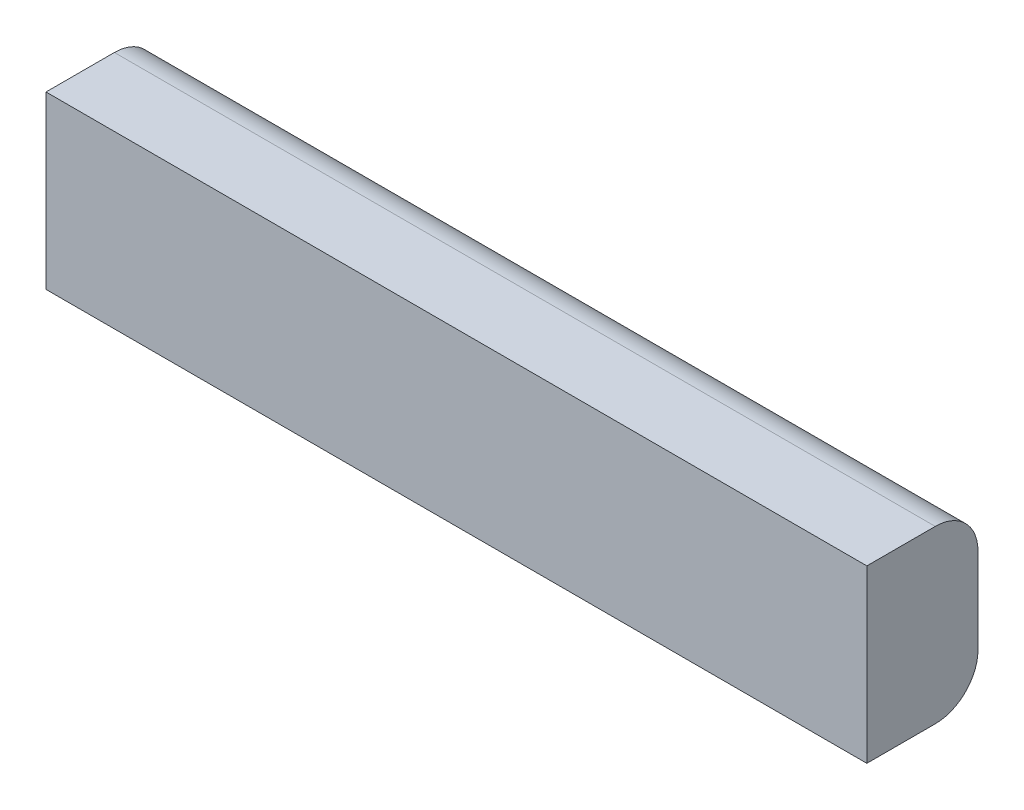
ISO-10303-21;
HEADER;
FILE_DESCRIPTION(('STEP AP214'),'2;1');
FILE_NAME('part.step','',(''),(''),'','','');
FILE_SCHEMA(('AUTOMOTIVE_DESIGN { 1 0 10303 214 1 1 1 1 }'));
ENDSEC;
DATA;
#1=APPLICATION_CONTEXT('core data for automotive mechanical design processes');
#2=APPLICATION_PROTOCOL_DEFINITION('international standard','automotive_design',2000,#1);
#3=PRODUCT_CONTEXT('',#1,'mechanical');
#4=PRODUCT('Part','Part','',(#3));
#5=PRODUCT_RELATED_PRODUCT_CATEGORY('part','',(#4));
#6=PRODUCT_DEFINITION_FORMATION('','',#4);
#7=PRODUCT_DEFINITION_CONTEXT('part definition',#1,'design');
#8=PRODUCT_DEFINITION('design','',#6,#7);
#9=PRODUCT_DEFINITION_SHAPE('','',#8);
#10=(LENGTH_UNIT() NAMED_UNIT(*) SI_UNIT(.MILLI.,.METRE.));
#11=(NAMED_UNIT(*) PLANE_ANGLE_UNIT() SI_UNIT($,.RADIAN.));
#12=(NAMED_UNIT(*) SI_UNIT($,.STERADIAN.) SOLID_ANGLE_UNIT());
#13=UNCERTAINTY_MEASURE_WITH_UNIT(LENGTH_MEASURE(1.E-05),#10,'distance_accuracy_value','');
#14=(GEOMETRIC_REPRESENTATION_CONTEXT(3) GLOBAL_UNCERTAINTY_ASSIGNED_CONTEXT((#13)) GLOBAL_UNIT_ASSIGNED_CONTEXT((#10,
#11,#12)) REPRESENTATION_CONTEXT('',''));
#15=CARTESIAN_POINT('',(0.,0.,0.));
#16=DIRECTION('',(0.,0.,1.));
#17=DIRECTION('',(1.,0.,0.));
#18=AXIS2_PLACEMENT_3D('',#15,#16,#17);
#19=CARTESIAN_POINT('',(304.8,66.0216606498195,1.42635379061369));
#20=DIRECTION('',(0.,0.,-1.));
#21=DIRECTION('',(0.,1.,0.));
#22=AXIS2_PLACEMENT_3D('',#19,#20,#21);
#23=PLANE('',#22);
#24=DIRECTION('',(0.,-1.,0.));
#25=VECTOR('',#24,1.);
#26=CARTESIAN_POINT('',(-304.8,66.0216606498195,1.42635379061369));
#27=LINE('',#26,#25);
#28=CARTESIAN_POINT('',(-304.8,66.0216606498195,1.42635379061369));
#29=VERTEX_POINT('',#28);
#30=CARTESIAN_POINT('',(-304.8,-60.9783393501805,1.42635379061368));
#31=VERTEX_POINT('',#30);
#32=EDGE_CURVE('E119',#29,#31,#27,.T.);
#33=ORIENTED_EDGE('',*,*,#32,.T.);
#34=DIRECTION('',(-1.,0.,0.));
#35=VECTOR('',#34,1.);
#36=CARTESIAN_POINT('',(304.8,-60.9783393501805,1.42635379061368));
#37=LINE('',#36,#35);
#38=CARTESIAN_POINT('',(304.8,-60.9783393501805,1.42635379061368));
#39=VERTEX_POINT('',#38);
#40=EDGE_CURVE('E11',#39,#31,#37,.T.);
#41=ORIENTED_EDGE('',*,*,#40,.F.);
#42=DIRECTION('',(0.,-1.,0.));
#43=VECTOR('',#42,1.);
#44=CARTESIAN_POINT('',(304.8,66.0216606498195,1.42635379061369));
#45=LINE('',#44,#43);
#46=CARTESIAN_POINT('',(304.8,66.0216606498195,1.42635379061369));
#47=VERTEX_POINT('',#46);
#48=EDGE_CURVE('E129',#47,#39,#45,.T.);
#49=ORIENTED_EDGE('',*,*,#48,.F.);
#50=DIRECTION('',(-1.,0.,0.));
#51=VECTOR('',#50,1.);
#52=CARTESIAN_POINT('',(304.8,66.0216606498195,1.42635379061369));
#53=LINE('',#52,#51);
#54=EDGE_CURVE('E115',#47,#29,#53,.T.);
#55=ORIENTED_EDGE('',*,*,#54,.T.);
#56=EDGE_LOOP('',(#33,#41,#49,#55));
#57=FACE_BOUND('',#56,.T.);
#58=ADVANCED_FACE('F35',(#57),#23,.F.);
#59=CARTESIAN_POINT('',(304.8,-60.9783393501805,-49.3736462093863));
#60=DIRECTION('',(0.,1.,0.));
#61=DIRECTION('',(0.,0.,1.));
#62=AXIS2_PLACEMENT_3D('',#59,#60,#61);
#63=PLANE('',#62);
#64=DIRECTION('',(0.,0.,-1.));
#65=VECTOR('',#64,1.);
#66=CARTESIAN_POINT('',(-304.8,-60.9783393501805,-49.3736462093863));
#67=LINE('',#66,#65);
#68=CARTESIAN_POINT('',(-304.8,-60.9783393501805,-49.3736462093863));
#69=VERTEX_POINT('',#68);
#70=EDGE_CURVE('E122',#31,#69,#67,.T.);
#71=ORIENTED_EDGE('',*,*,#70,.T.);
#72=DIRECTION('',(-1.,0.,0.));
#73=VECTOR('',#72,1.);
#74=CARTESIAN_POINT('',(304.8,-60.9783393501805,-49.3736462093863));
#75=LINE('',#74,#73);
#76=CARTESIAN_POINT('',(304.8,-60.9783393501805,-49.3736462093863));
#77=VERTEX_POINT('',#76);
#78=EDGE_CURVE('E43',#77,#69,#75,.T.);
#79=ORIENTED_EDGE('',*,*,#78,.F.);
#80=DIRECTION('',(0.,0.,-1.));
#81=VECTOR('',#80,1.);
#82=CARTESIAN_POINT('',(304.8,-60.9783393501805,-49.3736462093863));
#83=LINE('',#82,#81);
#84=EDGE_CURVE('E88',#39,#77,#83,.T.);
#85=ORIENTED_EDGE('',*,*,#84,.F.);
#86=ORIENTED_EDGE('',*,*,#40,.T.);
#87=EDGE_LOOP('',(#71,#79,#85,#86));
#88=FACE_BOUND('',#87,.T.);
#89=ADVANCED_FACE('F153',(#88),#63,.F.);
#90=CARTESIAN_POINT('',(304.8,-29.2283393501805,-49.3736462093863));
#91=DIRECTION('',(-1.,0.,0.));
#92=DIRECTION('',(0.,0.,1.));
#93=AXIS2_PLACEMENT_3D('',#90,#91,#92);
#94=CYLINDRICAL_SURFACE('',#93,31.75);
#95=CARTESIAN_POINT('',(-304.8,-29.2283393501805,-49.3736462093863));
#96=DIRECTION('',(1.,0.,0.));
#97=DIRECTION('',(0.,0.,1.));
#98=AXIS2_PLACEMENT_3D('',#95,#96,#97);
#99=CIRCLE('',#98,31.75);
#100=CARTESIAN_POINT('',(-304.8,-29.2283393501805,-81.1236462093863));
#101=VERTEX_POINT('',#100);
#102=EDGE_CURVE('E124',#69,#101,#99,.T.);
#103=ORIENTED_EDGE('',*,*,#102,.T.);
#104=DIRECTION('',(-1.,0.,0.));
#105=VECTOR('',#104,1.);
#106=CARTESIAN_POINT('',(304.8,-29.2283393501805,-81.1236462093863));
#107=LINE('',#106,#105);
#108=CARTESIAN_POINT('',(304.8,-29.2283393501805,-81.1236462093863));
#109=VERTEX_POINT('',#108);
#110=EDGE_CURVE('E110',#109,#101,#107,.T.);
#111=ORIENTED_EDGE('',*,*,#110,.F.);
#112=CARTESIAN_POINT('',(304.8,-29.2283393501805,-49.3736462093863));
#113=DIRECTION('',(1.,0.,0.));
#114=DIRECTION('',(0.,0.,1.));
#115=AXIS2_PLACEMENT_3D('',#112,#113,#114);
#116=CIRCLE('',#115,31.75);
#117=EDGE_CURVE('E101',#77,#109,#116,.T.);
#118=ORIENTED_EDGE('',*,*,#117,.F.);
#119=ORIENTED_EDGE('',*,*,#78,.T.);
#120=EDGE_LOOP('',(#103,#111,#118,#119));
#121=FACE_BOUND('',#120,.T.);
#122=ADVANCED_FACE('F135',(#121),#94,.T.);
#123=CARTESIAN_POINT('',(304.8,34.2716606498195,-81.1236462093863));
#124=DIRECTION('',(0.,0.,1.));
#125=DIRECTION('',(0.,-1.,0.));
#126=AXIS2_PLACEMENT_3D('',#123,#124,#125);
#127=PLANE('',#126);
#128=DIRECTION('',(0.,1.,0.));
#129=VECTOR('',#128,1.);
#130=CARTESIAN_POINT('',(-304.8,34.2716606498195,-81.1236462093863));
#131=LINE('',#130,#129);
#132=CARTESIAN_POINT('',(-304.8,34.2716606498195,-81.1236462093863));
#133=VERTEX_POINT('',#132);
#134=EDGE_CURVE('E109',#101,#133,#131,.T.);
#135=ORIENTED_EDGE('',*,*,#134,.T.);
#136=DIRECTION('',(-1.,0.,0.));
#137=VECTOR('',#136,1.);
#138=CARTESIAN_POINT('',(304.8,34.2716606498195,-81.1236462093863));
#139=LINE('',#138,#137);
#140=CARTESIAN_POINT('',(304.8,34.2716606498195,-81.1236462093863));
#141=VERTEX_POINT('',#140);
#142=EDGE_CURVE('E106',#141,#133,#139,.T.);
#143=ORIENTED_EDGE('',*,*,#142,.F.);
#144=DIRECTION('',(0.,1.,0.));
#145=VECTOR('',#144,1.);
#146=CARTESIAN_POINT('',(304.8,34.2716606498195,-81.1236462093863));
#147=LINE('',#146,#145);
#148=EDGE_CURVE('E95',#109,#141,#147,.T.);
#149=ORIENTED_EDGE('',*,*,#148,.F.);
#150=ORIENTED_EDGE('',*,*,#110,.T.);
#151=EDGE_LOOP('',(#135,#143,#149,#150));
#152=FACE_BOUND('',#151,.T.);
#153=ADVANCED_FACE('F107',(#152),#127,.F.);
#154=CARTESIAN_POINT('',(304.8,34.2716606498195,-49.3736462093863));
#155=DIRECTION('',(-1.,0.,0.));
#156=DIRECTION('',(0.,0.,1.));
#157=AXIS2_PLACEMENT_3D('',#154,#155,#156);
#158=CYLINDRICAL_SURFACE('',#157,31.75);
#159=CARTESIAN_POINT('',(-304.8,34.2716606498195,-49.3736462093863));
#160=DIRECTION('',(1.,0.,0.));
#161=DIRECTION('',(0.,0.,1.));
#162=AXIS2_PLACEMENT_3D('',#159,#160,#161);
#163=CIRCLE('',#162,31.75);
#164=CARTESIAN_POINT('',(-304.8,66.0216606498195,-49.3736462093862));
#165=VERTEX_POINT('',#164);
#166=EDGE_CURVE('E74',#133,#165,#163,.T.);
#167=ORIENTED_EDGE('',*,*,#166,.T.);
#168=DIRECTION('',(-1.,0.,0.));
#169=VECTOR('',#168,1.);
#170=CARTESIAN_POINT('',(304.8,66.0216606498195,-49.3736462093862));
#171=LINE('',#170,#169);
#172=CARTESIAN_POINT('',(304.8,66.0216606498195,-49.3736462093862));
#173=VERTEX_POINT('',#172);
#174=EDGE_CURVE('E111',#173,#165,#171,.T.);
#175=ORIENTED_EDGE('',*,*,#174,.F.);
#176=CARTESIAN_POINT('',(304.8,34.2716606498195,-49.3736462093863));
#177=DIRECTION('',(1.,0.,0.));
#178=DIRECTION('',(0.,0.,1.));
#179=AXIS2_PLACEMENT_3D('',#176,#177,#178);
#180=CIRCLE('',#179,31.75);
#181=EDGE_CURVE('E99',#141,#173,#180,.T.);
#182=ORIENTED_EDGE('',*,*,#181,.F.);
#183=ORIENTED_EDGE('',*,*,#142,.T.);
#184=EDGE_LOOP('',(#167,#175,#182,#183));
#185=FACE_BOUND('',#184,.T.);
#186=ADVANCED_FACE('F113',(#185),#158,.T.);
#187=CARTESIAN_POINT('',(304.8,66.0216606498195,-49.3736462093862));
#188=DIRECTION('',(0.,-1.,0.));
#189=DIRECTION('',(0.,0.,-1.));
#190=AXIS2_PLACEMENT_3D('',#187,#188,#189);
#191=PLANE('',#190);
#192=DIRECTION('',(0.,0.,1.));
#193=VECTOR('',#192,1.);
#194=CARTESIAN_POINT('',(-304.8,66.0216606498195,-49.3736462093862));
#195=LINE('',#194,#193);
#196=EDGE_CURVE('E80',#165,#29,#195,.T.);
#197=ORIENTED_EDGE('',*,*,#196,.T.);
#198=ORIENTED_EDGE('',*,*,#54,.F.);
#199=DIRECTION('',(0.,0.,1.));
#200=VECTOR('',#199,1.);
#201=CARTESIAN_POINT('',(304.8,66.0216606498195,-49.3736462093862));
#202=LINE('',#201,#200);
#203=EDGE_CURVE('E51',#173,#47,#202,.T.);
#204=ORIENTED_EDGE('',*,*,#203,.F.);
#205=ORIENTED_EDGE('',*,*,#174,.T.);
#206=EDGE_LOOP('',(#197,#198,#204,#205));
#207=FACE_BOUND('',#206,.T.);
#208=ADVANCED_FACE('F142',(#207),#191,.F.);
#209=CARTESIAN_POINT('',(304.8,-29.2283393501805,-49.3736462093863));
#210=DIRECTION('',(-1.,0.,0.));
#211=DIRECTION('',(0.,0.,1.));
#212=AXIS2_PLACEMENT_3D('',#209,#210,#211);
#213=PLANE('',#212);
#214=ORIENTED_EDGE('',*,*,#48,.T.);
#215=ORIENTED_EDGE('',*,*,#84,.T.);
#216=ORIENTED_EDGE('',*,*,#117,.T.);
#217=ORIENTED_EDGE('',*,*,#148,.T.);
#218=ORIENTED_EDGE('',*,*,#181,.T.);
#219=ORIENTED_EDGE('',*,*,#203,.T.);
#220=EDGE_LOOP('',(#214,#215,#216,#217,#218,#219));
#221=FACE_BOUND('',#220,.T.);
#222=ADVANCED_FACE('F97',(#221),#213,.F.);
#223=CARTESIAN_POINT('',(-304.8,-29.2283393501805,-49.3736462093863));
#224=DIRECTION('',(-1.,0.,0.));
#225=DIRECTION('',(0.,0.,1.));
#226=AXIS2_PLACEMENT_3D('',#223,#224,#225);
#227=PLANE('',#226);
#228=ORIENTED_EDGE('',*,*,#32,.F.);
#229=ORIENTED_EDGE('',*,*,#196,.F.);
#230=ORIENTED_EDGE('',*,*,#166,.F.);
#231=ORIENTED_EDGE('',*,*,#134,.F.);
#232=ORIENTED_EDGE('',*,*,#102,.F.);
#233=ORIENTED_EDGE('',*,*,#70,.F.);
#234=EDGE_LOOP('',(#228,#229,#230,#231,#232,#233));
#235=FACE_BOUND('',#234,.T.);
#236=ADVANCED_FACE('F138',(#235),#227,.T.);
#237=CLOSED_SHELL('',(#58,#89,#122,#153,#186,#208,#222,#236));
#238=MANIFOLD_SOLID_BREP('B2',#237);
#239=ADVANCED_BREP_SHAPE_REPRESENTATION('',(#18,#238),#14);
#240=SHAPE_DEFINITION_REPRESENTATION(#9,#239);
ENDSEC;
END-ISO-10303-21;
